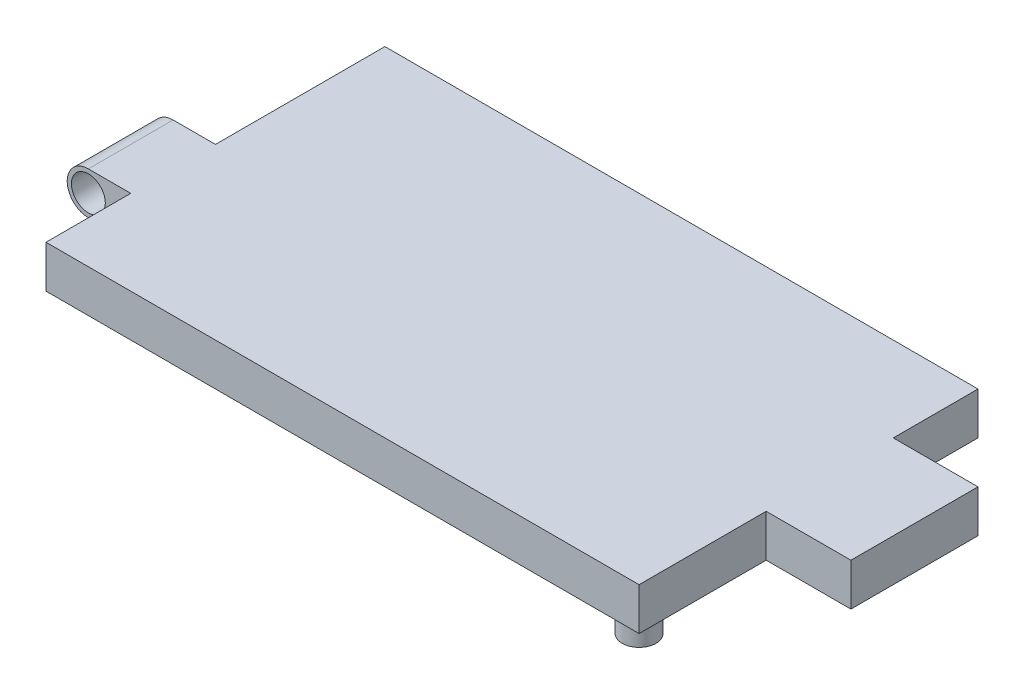
ISO-10303-21;
HEADER;
FILE_DESCRIPTION(('STEP AP214'),'2;1');
FILE_NAME('part.step','',(''),(''),'','','');
FILE_SCHEMA(('AUTOMOTIVE_DESIGN { 1 0 10303 214 1 1 1 1 }'));
ENDSEC;
DATA;
#1=APPLICATION_CONTEXT('core data for automotive mechanical design processes');
#2=APPLICATION_PROTOCOL_DEFINITION('international standard','automotive_design',2000,#1);
#3=PRODUCT_CONTEXT('',#1,'mechanical');
#4=PRODUCT('Part','Part','',(#3));
#5=PRODUCT_RELATED_PRODUCT_CATEGORY('part','',(#4));
#6=PRODUCT_DEFINITION_FORMATION('','',#4);
#7=PRODUCT_DEFINITION_CONTEXT('part definition',#1,'design');
#8=PRODUCT_DEFINITION('design','',#6,#7);
#9=PRODUCT_DEFINITION_SHAPE('','',#8);
#10=(LENGTH_UNIT() NAMED_UNIT(*) SI_UNIT(.MILLI.,.METRE.));
#11=(NAMED_UNIT(*) PLANE_ANGLE_UNIT() SI_UNIT($,.RADIAN.));
#12=(NAMED_UNIT(*) SI_UNIT($,.STERADIAN.) SOLID_ANGLE_UNIT());
#13=UNCERTAINTY_MEASURE_WITH_UNIT(LENGTH_MEASURE(1.E-05),#10,'distance_accuracy_value','');
#14=(GEOMETRIC_REPRESENTATION_CONTEXT(3) GLOBAL_UNCERTAINTY_ASSIGNED_CONTEXT((#13)) GLOBAL_UNIT_ASSIGNED_CONTEXT((#10,
#11,#12)) REPRESENTATION_CONTEXT('',''));
#15=CARTESIAN_POINT('',(0.,0.,0.));
#16=DIRECTION('',(0.,0.,1.));
#17=DIRECTION('',(1.,0.,0.));
#18=AXIS2_PLACEMENT_3D('',#15,#16,#17);
#19=CARTESIAN_POINT('',(0.,-2.5,-5.));
#20=DIRECTION('',(0.,-1.,0.));
#21=DIRECTION('',(0.,0.,-1.));
#22=AXIS2_PLACEMENT_3D('',#19,#20,#21);
#23=PLANE('',#22);
#24=DIRECTION('',(0.,0.,1.));
#25=VECTOR('',#24,1.);
#26=CARTESIAN_POINT('',(-5.,-2.49999999999998,0.));
#27=LINE('',#26,#25);
#28=CARTESIAN_POINT('',(-5.,-2.49999999999998,0.));
#29=VERTEX_POINT('',#28);
#30=CARTESIAN_POINT('',(-5.,-2.49999999999998,15.));
#31=VERTEX_POINT('',#30);
#32=EDGE_CURVE('E151',#29,#31,#27,.T.);
#33=ORIENTED_EDGE('',*,*,#32,.T.);
#34=DIRECTION('',(1.,0.,0.));
#35=VECTOR('',#34,1.);
#36=CARTESIAN_POINT('',(-75.,-2.5,15.));
#37=LINE('',#36,#35);
#38=CARTESIAN_POINT('',(-75.,-2.5,15.));
#39=VERTEX_POINT('',#38);
#40=EDGE_CURVE('E218',#39,#31,#37,.T.);
#41=ORIENTED_EDGE('',*,*,#40,.F.);
#42=DIRECTION('',(0.,0.,-1.));
#43=VECTOR('',#42,1.);
#44=CARTESIAN_POINT('',(-75.,-2.5,15.));
#45=LINE('',#44,#43);
#46=CARTESIAN_POINT('',(-75.,-2.5,5.));
#47=VERTEX_POINT('',#46);
#48=EDGE_CURVE('E221',#39,#47,#45,.T.);
#49=ORIENTED_EDGE('',*,*,#48,.T.);
#50=DIRECTION('',(1.,0.,0.));
#51=VECTOR('',#50,1.);
#52=CARTESIAN_POINT('',(0.,-2.5,5.));
#53=LINE('',#52,#51);
#54=CARTESIAN_POINT('',(-80.,-2.5,5.));
#55=VERTEX_POINT('',#54);
#56=EDGE_CURVE('E247',#55,#47,#53,.T.);
#57=ORIENTED_EDGE('',*,*,#56,.F.);
#58=DIRECTION('',(0.,0.,1.));
#59=VECTOR('',#58,1.);
#60=CARTESIAN_POINT('',(-80.,-2.5,-5.));
#61=LINE('',#60,#59);
#62=CARTESIAN_POINT('',(-80.,-2.5,-5.));
#63=VERTEX_POINT('',#62);
#64=EDGE_CURVE('E42',#63,#55,#61,.T.);
#65=ORIENTED_EDGE('',*,*,#64,.F.);
#66=DIRECTION('',(1.,0.,0.));
#67=VECTOR('',#66,1.);
#68=CARTESIAN_POINT('',(0.,-2.5,-5.));
#69=LINE('',#68,#67);
#70=CARTESIAN_POINT('',(-75.,-2.5,-5.));
#71=VERTEX_POINT('',#70);
#72=EDGE_CURVE('E209',#63,#71,#69,.T.);
#73=ORIENTED_EDGE('',*,*,#72,.T.);
#74=DIRECTION('',(0.,0.,1.));
#75=VECTOR('',#74,1.);
#76=CARTESIAN_POINT('',(-75.,-2.49999999999999,-15.));
#77=LINE('',#76,#75);
#78=CARTESIAN_POINT('',(-75.,-2.49999999999998,-25.));
#79=VERTEX_POINT('',#78);
#80=EDGE_CURVE('E132',#79,#71,#77,.T.);
#81=ORIENTED_EDGE('',*,*,#80,.F.);
#82=DIRECTION('',(-1.,0.,0.));
#83=VECTOR('',#82,1.);
#84=CARTESIAN_POINT('',(-4.99999999999999,-2.49999999999998,-25.));
#85=LINE('',#84,#83);
#86=CARTESIAN_POINT('',(-4.99999999999999,-2.49999999999998,-25.));
#87=VERTEX_POINT('',#86);
#88=EDGE_CURVE('E125',#87,#79,#85,.T.);
#89=ORIENTED_EDGE('',*,*,#88,.F.);
#90=DIRECTION('',(0.,0.,1.));
#91=VECTOR('',#90,1.);
#92=CARTESIAN_POINT('',(-4.99999999999999,-2.49999999999998,-25.));
#93=LINE('',#92,#91);
#94=CARTESIAN_POINT('',(-4.99999999999999,-2.49999999999998,-15.));
#95=VERTEX_POINT('',#94);
#96=EDGE_CURVE('E130',#87,#95,#93,.T.);
#97=ORIENTED_EDGE('',*,*,#96,.T.);
#98=DIRECTION('',(-1.,0.,0.));
#99=VECTOR('',#98,1.);
#100=CARTESIAN_POINT('',(0.,-2.5,-15.));
#101=LINE('',#100,#99);
#102=CARTESIAN_POINT('',(5.,-2.49999999999998,-15.));
#103=VERTEX_POINT('',#102);
#104=EDGE_CURVE('E155',#103,#95,#101,.T.);
#105=ORIENTED_EDGE('',*,*,#104,.F.);
#106=DIRECTION('',(0.,0.,-1.));
#107=VECTOR('',#106,1.);
#108=CARTESIAN_POINT('',(5.,-2.49999999999998,-15.));
#109=LINE('',#108,#107);
#110=CARTESIAN_POINT('',(5.,-2.49999999999998,0.));
#111=VERTEX_POINT('',#110);
#112=EDGE_CURVE('E174',#111,#103,#109,.T.);
#113=ORIENTED_EDGE('',*,*,#112,.F.);
#114=DIRECTION('',(1.,0.,0.));
#115=VECTOR('',#114,1.);
#116=CARTESIAN_POINT('',(5.,-2.49999999999998,0.));
#117=LINE('',#116,#115);
#118=EDGE_CURVE('E178',#29,#111,#117,.T.);
#119=ORIENTED_EDGE('',*,*,#118,.F.);
#120=EDGE_LOOP('',(#33,#41,#49,#57,#65,#73,#81,#89,#97,#105,#113,#119));
#121=FACE_BOUND('',#120,.T.);
#122=CARTESIAN_POINT('',(-10.,-2.5,10.));
#123=DIRECTION('',(0.,-1.,0.));
#124=DIRECTION('',(0.,0.,-1.));
#125=AXIS2_PLACEMENT_3D('',#122,#123,#124);
#126=CIRCLE('',#125,2.);
#127=CARTESIAN_POINT('',(-10.,-2.5,8.));
#128=VERTEX_POINT('',#127);
#129=EDGE_CURVE('E264',#128,#128,#126,.T.);
#130=ORIENTED_EDGE('',*,*,#129,.F.);
#131=EDGE_LOOP('',(#130));
#132=FACE_BOUND('',#131,.T.);
#133=ADVANCED_FACE('F33',(#121,#132),#23,.T.);
#134=CARTESIAN_POINT('',(-80.,0.,-5.));
#135=DIRECTION('',(0.,0.,1.));
#136=DIRECTION('',(1.,0.,0.));
#137=AXIS2_PLACEMENT_3D('',#134,#135,#136);
#138=PLANE('',#137);
#139=CARTESIAN_POINT('',(-80.,0.,-5.));
#140=DIRECTION('',(0.,0.,1.));
#141=DIRECTION('',(1.,0.,0.));
#142=AXIS2_PLACEMENT_3D('',#139,#140,#141);
#143=CIRCLE('',#142,2.);
#144=CARTESIAN_POINT('',(-78.,0.,-5.));
#145=VERTEX_POINT('',#144);
#146=EDGE_CURVE('E253',#145,#145,#143,.T.);
#147=ORIENTED_EDGE('',*,*,#146,.T.);
#148=EDGE_LOOP('',(#147));
#149=FACE_BOUND('',#148,.T.);
#150=DIRECTION('',(0.,1.,0.));
#151=VECTOR('',#150,1.);
#152=CARTESIAN_POINT('',(-75.,-2.49999999999999,-5.));
#153=LINE('',#152,#151);
#154=CARTESIAN_POINT('',(-75.,2.50000000000002,-5.));
#155=VERTEX_POINT('',#154);
#156=EDGE_CURVE('E58',#71,#155,#153,.T.);
#157=ORIENTED_EDGE('',*,*,#156,.F.);
#158=ORIENTED_EDGE('',*,*,#72,.F.);
#159=CARTESIAN_POINT('',(-80.,0.,-5.));
#160=DIRECTION('',(0.,0.,1.));
#161=DIRECTION('',(1.,0.,0.));
#162=AXIS2_PLACEMENT_3D('',#159,#160,#161);
#163=CIRCLE('',#162,2.50000000000001);
#164=CARTESIAN_POINT('',(-80.,2.50000000000002,-5.));
#165=VERTEX_POINT('',#164);
#166=EDGE_CURVE('E255',#165,#63,#163,.T.);
#167=ORIENTED_EDGE('',*,*,#166,.F.);
#168=DIRECTION('',(-1.,0.,0.));
#169=VECTOR('',#168,1.);
#170=CARTESIAN_POINT('',(-80.,2.50000000000002,-5.));
#171=LINE('',#170,#169);
#172=EDGE_CURVE('E241',#155,#165,#171,.T.);
#173=ORIENTED_EDGE('',*,*,#172,.F.);
#174=EDGE_LOOP('',(#157,#158,#167,#173));
#175=FACE_BOUND('',#174,.T.);
#176=ADVANCED_FACE('F278',(#149,#175),#138,.F.);
#177=CARTESIAN_POINT('',(-80.,0.,-5.));
#178=DIRECTION('',(0.,0.,1.));
#179=DIRECTION('',(1.,0.,0.));
#180=AXIS2_PLACEMENT_3D('',#177,#178,#179);
#181=CYLINDRICAL_SURFACE('',#180,2.50000000000001);
#182=ORIENTED_EDGE('',*,*,#64,.T.);
#183=CARTESIAN_POINT('',(-80.,0.,5.));
#184=DIRECTION('',(0.,0.,1.));
#185=DIRECTION('',(1.,0.,0.));
#186=AXIS2_PLACEMENT_3D('',#183,#184,#185);
#187=CIRCLE('',#186,2.50000000000001);
#188=CARTESIAN_POINT('',(-80.,2.50000000000002,5.));
#189=VERTEX_POINT('',#188);
#190=EDGE_CURVE('E249',#189,#55,#187,.T.);
#191=ORIENTED_EDGE('',*,*,#190,.F.);
#192=DIRECTION('',(0.,0.,1.));
#193=VECTOR('',#192,1.);
#194=CARTESIAN_POINT('',(-80.,2.50000000000002,-5.));
#195=LINE('',#194,#193);
#196=EDGE_CURVE('E11',#165,#189,#195,.T.);
#197=ORIENTED_EDGE('',*,*,#196,.F.);
#198=ORIENTED_EDGE('',*,*,#166,.T.);
#199=EDGE_LOOP('',(#182,#191,#197,#198));
#200=FACE_BOUND('',#199,.T.);
#201=ADVANCED_FACE('F35',(#200),#181,.T.);
#202=CARTESIAN_POINT('',(-80.,2.50000000000002,-5.));
#203=DIRECTION('',(0.,1.,0.));
#204=DIRECTION('',(0.,0.,1.));
#205=AXIS2_PLACEMENT_3D('',#202,#203,#204);
#206=PLANE('',#205);
#207=DIRECTION('',(0.,0.,1.));
#208=VECTOR('',#207,1.);
#209=CARTESIAN_POINT('',(-5.,2.50000000000002,0.));
#210=LINE('',#209,#208);
#211=CARTESIAN_POINT('',(-5.,2.50000000000002,0.));
#212=VERTEX_POINT('',#211);
#213=CARTESIAN_POINT('',(-5.,2.50000000000002,15.));
#214=VERTEX_POINT('',#213);
#215=EDGE_CURVE('E148',#212,#214,#210,.T.);
#216=ORIENTED_EDGE('',*,*,#215,.F.);
#217=DIRECTION('',(1.,0.,0.));
#218=VECTOR('',#217,1.);
#219=CARTESIAN_POINT('',(5.,2.50000000000002,0.));
#220=LINE('',#219,#218);
#221=CARTESIAN_POINT('',(5.,2.50000000000002,0.));
#222=VERTEX_POINT('',#221);
#223=EDGE_CURVE('E171',#212,#222,#220,.T.);
#224=ORIENTED_EDGE('',*,*,#223,.T.);
#225=DIRECTION('',(0.,0.,-1.));
#226=VECTOR('',#225,1.);
#227=CARTESIAN_POINT('',(5.,2.50000000000002,-15.));
#228=LINE('',#227,#226);
#229=CARTESIAN_POINT('',(5.,2.50000000000002,-15.));
#230=VERTEX_POINT('',#229);
#231=EDGE_CURVE('E179',#222,#230,#228,.T.);
#232=ORIENTED_EDGE('',*,*,#231,.T.);
#233=DIRECTION('',(1.,0.,0.));
#234=VECTOR('',#233,1.);
#235=CARTESIAN_POINT('',(-75.,2.50000000000002,-15.));
#236=LINE('',#235,#234);
#237=CARTESIAN_POINT('',(-4.99999999999999,2.50000000000002,-15.));
#238=VERTEX_POINT('',#237);
#239=EDGE_CURVE('E189',#238,#230,#236,.T.);
#240=ORIENTED_EDGE('',*,*,#239,.F.);
#241=DIRECTION('',(0.,0.,1.));
#242=VECTOR('',#241,1.);
#243=CARTESIAN_POINT('',(-4.99999999999999,2.50000000000002,-25.));
#244=LINE('',#243,#242);
#245=CARTESIAN_POINT('',(-4.99999999999999,2.50000000000002,-25.));
#246=VERTEX_POINT('',#245);
#247=EDGE_CURVE('E149',#246,#238,#244,.T.);
#248=ORIENTED_EDGE('',*,*,#247,.F.);
#249=DIRECTION('',(1.,0.,0.));
#250=VECTOR('',#249,1.);
#251=CARTESIAN_POINT('',(-4.99999999999999,2.50000000000002,-25.));
#252=LINE('',#251,#250);
#253=CARTESIAN_POINT('',(-75.,2.50000000000002,-25.));
#254=VERTEX_POINT('',#253);
#255=EDGE_CURVE('E142',#254,#246,#252,.T.);
#256=ORIENTED_EDGE('',*,*,#255,.F.);
#257=DIRECTION('',(0.,0.,1.));
#258=VECTOR('',#257,1.);
#259=CARTESIAN_POINT('',(-75.,2.50000000000002,-15.));
#260=LINE('',#259,#258);
#261=EDGE_CURVE('E203',#254,#155,#260,.T.);
#262=ORIENTED_EDGE('',*,*,#261,.T.);
#263=ORIENTED_EDGE('',*,*,#172,.T.);
#264=ORIENTED_EDGE('',*,*,#196,.T.);
#265=DIRECTION('',(-1.,0.,0.));
#266=VECTOR('',#265,1.);
#267=CARTESIAN_POINT('',(-80.,2.50000000000002,5.));
#268=LINE('',#267,#266);
#269=CARTESIAN_POINT('',(-75.,2.50000000000002,5.));
#270=VERTEX_POINT('',#269);
#271=EDGE_CURVE('E230',#270,#189,#268,.T.);
#272=ORIENTED_EDGE('',*,*,#271,.F.);
#273=DIRECTION('',(0.,0.,-1.));
#274=VECTOR('',#273,1.);
#275=CARTESIAN_POINT('',(-75.,2.50000000000002,15.));
#276=LINE('',#275,#274);
#277=CARTESIAN_POINT('',(-75.,2.50000000000002,15.));
#278=VERTEX_POINT('',#277);
#279=EDGE_CURVE('E235',#278,#270,#276,.T.);
#280=ORIENTED_EDGE('',*,*,#279,.F.);
#281=DIRECTION('',(-1.,0.,0.));
#282=VECTOR('',#281,1.);
#283=CARTESIAN_POINT('',(0.,2.50000000000002,15.));
#284=LINE('',#283,#282);
#285=EDGE_CURVE('E214',#214,#278,#284,.T.);
#286=ORIENTED_EDGE('',*,*,#285,.F.);
#287=EDGE_LOOP('',(#216,#224,#232,#240,#248,#256,#262,#263,#264,#272,#280,#286));
#288=FACE_BOUND('',#287,.T.);
#289=ADVANCED_FACE('F287',(#288),#206,.T.);
#290=CARTESIAN_POINT('',(-80.,0.,-5.));
#291=DIRECTION('',(0.,0.,1.));
#292=DIRECTION('',(1.,0.,0.));
#293=AXIS2_PLACEMENT_3D('',#290,#291,#292);
#294=CYLINDRICAL_SURFACE('',#293,2.);
#295=ORIENTED_EDGE('',*,*,#146,.F.);
#296=EDGE_LOOP('',(#295));
#297=FACE_BOUND('',#296,.T.);
#298=CARTESIAN_POINT('',(-80.,0.,5.));
#299=DIRECTION('',(0.,0.,1.));
#300=DIRECTION('',(1.,0.,0.));
#301=AXIS2_PLACEMENT_3D('',#298,#299,#300);
#302=CIRCLE('',#301,2.);
#303=CARTESIAN_POINT('',(-78.,0.,5.));
#304=VERTEX_POINT('',#303);
#305=EDGE_CURVE('E224',#304,#304,#302,.T.);
#306=ORIENTED_EDGE('',*,*,#305,.T.);
#307=EDGE_LOOP('',(#306));
#308=FACE_BOUND('',#307,.T.);
#309=ADVANCED_FACE('F289',(#297,#308),#294,.F.);
#310=CARTESIAN_POINT('',(-80.,0.,5.));
#311=DIRECTION('',(0.,0.,1.));
#312=DIRECTION('',(1.,0.,0.));
#313=AXIS2_PLACEMENT_3D('',#310,#311,#312);
#314=PLANE('',#313);
#315=DIRECTION('',(0.,-1.,0.));
#316=VECTOR('',#315,1.);
#317=CARTESIAN_POINT('',(-75.,2.50000000000002,5.));
#318=LINE('',#317,#316);
#319=EDGE_CURVE('E202',#270,#47,#318,.T.);
#320=ORIENTED_EDGE('',*,*,#319,.F.);
#321=ORIENTED_EDGE('',*,*,#271,.T.);
#322=ORIENTED_EDGE('',*,*,#190,.T.);
#323=ORIENTED_EDGE('',*,*,#56,.T.);
#324=EDGE_LOOP('',(#320,#321,#322,#323));
#325=FACE_BOUND('',#324,.T.);
#326=ORIENTED_EDGE('',*,*,#305,.F.);
#327=EDGE_LOOP('',(#326));
#328=FACE_BOUND('',#327,.T.);
#329=ADVANCED_FACE('F294',(#325,#328),#314,.T.);
#330=CARTESIAN_POINT('',(-75.,2.50000000000002,15.));
#331=DIRECTION('',(1.,0.,0.));
#332=DIRECTION('',(0.,0.,-1.));
#333=AXIS2_PLACEMENT_3D('',#330,#331,#332);
#334=PLANE('',#333);
#335=ORIENTED_EDGE('',*,*,#319,.T.);
#336=ORIENTED_EDGE('',*,*,#48,.F.);
#337=DIRECTION('',(0.,-1.,0.));
#338=VECTOR('',#337,1.);
#339=CARTESIAN_POINT('',(-75.,2.50000000000002,15.));
#340=LINE('',#339,#338);
#341=EDGE_CURVE('E216',#278,#39,#340,.T.);
#342=ORIENTED_EDGE('',*,*,#341,.F.);
#343=ORIENTED_EDGE('',*,*,#279,.T.);
#344=EDGE_LOOP('',(#335,#336,#342,#343));
#345=FACE_BOUND('',#344,.T.);
#346=ADVANCED_FACE('F298',(#345),#334,.F.);
#347=CARTESIAN_POINT('',(0.,0.,15.));
#348=DIRECTION('',(0.,0.,1.));
#349=DIRECTION('',(1.,0.,0.));
#350=AXIS2_PLACEMENT_3D('',#347,#348,#349);
#351=PLANE('',#350);
#352=DIRECTION('',(0.,1.,0.));
#353=VECTOR('',#352,1.);
#354=CARTESIAN_POINT('',(-5.,-2.49999999999998,15.));
#355=LINE('',#354,#353);
#356=EDGE_CURVE('E168',#31,#214,#355,.T.);
#357=ORIENTED_EDGE('',*,*,#356,.T.);
#358=ORIENTED_EDGE('',*,*,#285,.T.);
#359=ORIENTED_EDGE('',*,*,#341,.T.);
#360=ORIENTED_EDGE('',*,*,#40,.T.);
#361=EDGE_LOOP('',(#357,#358,#359,#360));
#362=FACE_BOUND('',#361,.T.);
#363=ADVANCED_FACE('F302',(#362),#351,.T.);
#364=CARTESIAN_POINT('',(-75.,-2.49999999999999,-15.));
#365=DIRECTION('',(1.,0.,0.));
#366=DIRECTION('',(0.,0.,-1.));
#367=AXIS2_PLACEMENT_3D('',#364,#365,#366);
#368=PLANE('',#367);
#369=ORIENTED_EDGE('',*,*,#156,.T.);
#370=ORIENTED_EDGE('',*,*,#261,.F.);
#371=DIRECTION('',(0.,1.,0.));
#372=VECTOR('',#371,1.);
#373=CARTESIAN_POINT('',(-75.,-2.49999999999998,-25.));
#374=LINE('',#373,#372);
#375=EDGE_CURVE('E136',#79,#254,#374,.T.);
#376=ORIENTED_EDGE('',*,*,#375,.F.);
#377=ORIENTED_EDGE('',*,*,#80,.T.);
#378=EDGE_LOOP('',(#369,#370,#376,#377));
#379=FACE_BOUND('',#378,.T.);
#380=ADVANCED_FACE('F262',(#379),#368,.F.);
#381=CARTESIAN_POINT('',(0.,0.,-15.));
#382=DIRECTION('',(0.,0.,-1.));
#383=DIRECTION('',(-1.,0.,0.));
#384=AXIS2_PLACEMENT_3D('',#381,#382,#383);
#385=PLANE('',#384);
#386=DIRECTION('',(0.,-1.,0.));
#387=VECTOR('',#386,1.);
#388=CARTESIAN_POINT('',(-4.99999999999999,-2.49999999999998,-15.));
#389=LINE('',#388,#387);
#390=EDGE_CURVE('E50',#238,#95,#389,.T.);
#391=ORIENTED_EDGE('',*,*,#390,.F.);
#392=ORIENTED_EDGE('',*,*,#239,.T.);
#393=DIRECTION('',(0.,1.,0.));
#394=VECTOR('',#393,1.);
#395=CARTESIAN_POINT('',(5.,-2.49999999999998,-15.));
#396=LINE('',#395,#394);
#397=EDGE_CURVE('E182',#103,#230,#396,.T.);
#398=ORIENTED_EDGE('',*,*,#397,.F.);
#399=ORIENTED_EDGE('',*,*,#104,.T.);
#400=EDGE_LOOP('',(#391,#392,#398,#399));
#401=FACE_BOUND('',#400,.T.);
#402=ADVANCED_FACE('F309',(#401),#385,.T.);
#403=CARTESIAN_POINT('',(5.,-2.49999999999998,-15.));
#404=DIRECTION('',(1.,0.,0.));
#405=DIRECTION('',(0.,0.,-1.));
#406=AXIS2_PLACEMENT_3D('',#403,#404,#405);
#407=PLANE('',#406);
#408=ORIENTED_EDGE('',*,*,#231,.F.);
#409=DIRECTION('',(0.,1.,0.));
#410=VECTOR('',#409,1.);
#411=CARTESIAN_POINT('',(5.,-2.49999999999998,0.));
#412=LINE('',#411,#410);
#413=EDGE_CURVE('E177',#111,#222,#412,.T.);
#414=ORIENTED_EDGE('',*,*,#413,.F.);
#415=ORIENTED_EDGE('',*,*,#112,.T.);
#416=ORIENTED_EDGE('',*,*,#397,.T.);
#417=EDGE_LOOP('',(#408,#414,#415,#416));
#418=FACE_BOUND('',#417,.T.);
#419=ADVANCED_FACE('F312',(#418),#407,.T.);
#420=CARTESIAN_POINT('',(5.,-2.49999999999998,0.));
#421=DIRECTION('',(0.,0.,1.));
#422=DIRECTION('',(1.,0.,0.));
#423=AXIS2_PLACEMENT_3D('',#420,#421,#422);
#424=PLANE('',#423);
#425=ORIENTED_EDGE('',*,*,#223,.F.);
#426=DIRECTION('',(0.,1.,0.));
#427=VECTOR('',#426,1.);
#428=CARTESIAN_POINT('',(-5.,-2.49999999999998,0.));
#429=LINE('',#428,#427);
#430=EDGE_CURVE('E166',#29,#212,#429,.T.);
#431=ORIENTED_EDGE('',*,*,#430,.F.);
#432=ORIENTED_EDGE('',*,*,#118,.T.);
#433=ORIENTED_EDGE('',*,*,#413,.T.);
#434=EDGE_LOOP('',(#425,#431,#432,#433));
#435=FACE_BOUND('',#434,.T.);
#436=ADVANCED_FACE('F313',(#435),#424,.T.);
#437=CARTESIAN_POINT('',(-5.,-2.49999999999998,0.));
#438=DIRECTION('',(-1.,0.,0.));
#439=DIRECTION('',(0.,0.,1.));
#440=AXIS2_PLACEMENT_3D('',#437,#438,#439);
#441=PLANE('',#440);
#442=ORIENTED_EDGE('',*,*,#215,.T.);
#443=ORIENTED_EDGE('',*,*,#356,.F.);
#444=ORIENTED_EDGE('',*,*,#32,.F.);
#445=ORIENTED_EDGE('',*,*,#430,.T.);
#446=EDGE_LOOP('',(#442,#443,#444,#445));
#447=FACE_BOUND('',#446,.T.);
#448=ADVANCED_FACE('F316',(#447),#441,.F.);
#449=CARTESIAN_POINT('',(-4.99999999999999,-2.49999999999998,-25.));
#450=DIRECTION('',(-1.,0.,0.));
#451=DIRECTION('',(0.,0.,1.));
#452=AXIS2_PLACEMENT_3D('',#449,#450,#451);
#453=PLANE('',#452);
#454=ORIENTED_EDGE('',*,*,#390,.T.);
#455=ORIENTED_EDGE('',*,*,#96,.F.);
#456=DIRECTION('',(0.,-1.,0.));
#457=VECTOR('',#456,1.);
#458=CARTESIAN_POINT('',(-4.99999999999999,-2.49999999999998,-25.));
#459=LINE('',#458,#457);
#460=EDGE_CURVE('E137',#246,#87,#459,.T.);
#461=ORIENTED_EDGE('',*,*,#460,.F.);
#462=ORIENTED_EDGE('',*,*,#247,.T.);
#463=EDGE_LOOP('',(#454,#455,#461,#462));
#464=FACE_BOUND('',#463,.T.);
#465=ADVANCED_FACE('F147',(#464),#453,.F.);
#466=CARTESIAN_POINT('',(0.,0.,-25.));
#467=DIRECTION('',(0.,0.,1.));
#468=DIRECTION('',(1.,0.,0.));
#469=AXIS2_PLACEMENT_3D('',#466,#467,#468);
#470=PLANE('',#469);
#471=ORIENTED_EDGE('',*,*,#460,.T.);
#472=ORIENTED_EDGE('',*,*,#88,.T.);
#473=ORIENTED_EDGE('',*,*,#375,.T.);
#474=ORIENTED_EDGE('',*,*,#255,.T.);
#475=EDGE_LOOP('',(#471,#472,#473,#474));
#476=FACE_BOUND('',#475,.T.);
#477=ADVANCED_FACE('F140',(#476),#470,.F.);
#478=CARTESIAN_POINT('',(-10.,-7.5,10.));
#479=DIRECTION('',(0.,1.,0.));
#480=DIRECTION('',(0.,0.,1.));
#481=AXIS2_PLACEMENT_3D('',#478,#479,#480);
#482=CYLINDRICAL_SURFACE('',#481,2.);
#483=CARTESIAN_POINT('',(-10.,-7.5,10.));
#484=DIRECTION('',(0.,-1.,0.));
#485=DIRECTION('',(0.,0.,-1.));
#486=AXIS2_PLACEMENT_3D('',#483,#484,#485);
#487=CIRCLE('',#486,2.);
#488=CARTESIAN_POINT('',(-10.,-7.5,8.));
#489=VERTEX_POINT('',#488);
#490=EDGE_CURVE('E161',#489,#489,#487,.T.);
#491=ORIENTED_EDGE('',*,*,#490,.F.);
#492=EDGE_LOOP('',(#491));
#493=FACE_BOUND('',#492,.T.);
#494=ORIENTED_EDGE('',*,*,#129,.T.);
#495=EDGE_LOOP('',(#494));
#496=FACE_BOUND('',#495,.T.);
#497=ADVANCED_FACE('F272',(#493,#496),#482,.T.);
#498=CARTESIAN_POINT('',(-10.,-7.5,10.));
#499=DIRECTION('',(0.,-1.,0.));
#500=DIRECTION('',(0.,0.,-1.));
#501=AXIS2_PLACEMENT_3D('',#498,#499,#500);
#502=PLANE('',#501);
#503=ORIENTED_EDGE('',*,*,#490,.T.);
#504=EDGE_LOOP('',(#503));
#505=FACE_BOUND('',#504,.T.);
#506=ADVANCED_FACE('F270',(#505),#502,.T.);
#507=CLOSED_SHELL('',(#133,#176,#201,#289,#309,#329,#346,#363,#380,#402,#419,#436,#448,#465,
#477,#497,#506));
#508=MANIFOLD_SOLID_BREP('B2',#507);
#509=ADVANCED_BREP_SHAPE_REPRESENTATION('',(#18,#508),#14);
#510=SHAPE_DEFINITION_REPRESENTATION(#9,#509);
ENDSEC;
END-ISO-10303-21;
